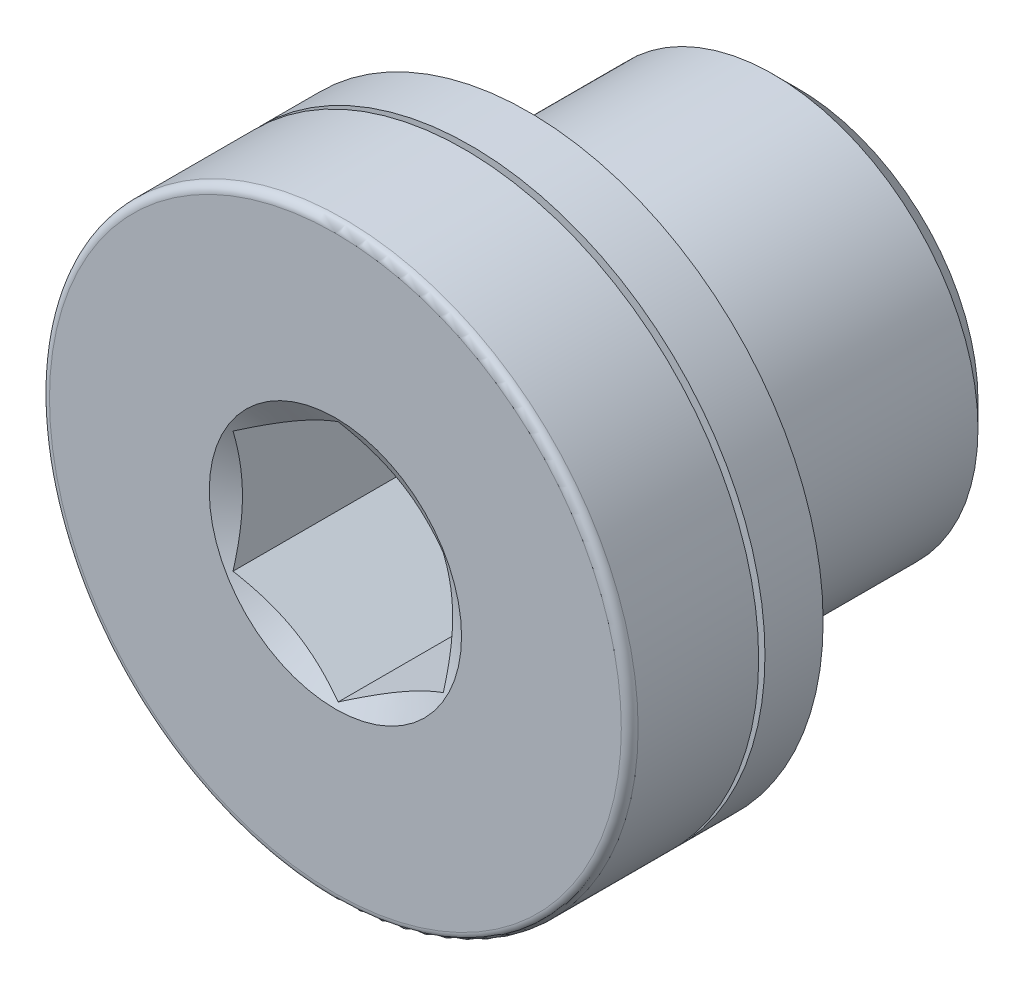
ISO-10303-21;
HEADER;
FILE_DESCRIPTION(('STEP AP214'),'2;1');
FILE_NAME('part.step','',(''),(''),'','','');
FILE_SCHEMA(('AUTOMOTIVE_DESIGN { 1 0 10303 214 1 1 1 1 }'));
ENDSEC;
DATA;
#1=APPLICATION_CONTEXT('core data for automotive mechanical design processes');
#2=APPLICATION_PROTOCOL_DEFINITION('international standard','automotive_design',2000,#1);
#3=PRODUCT_CONTEXT('',#1,'mechanical');
#4=PRODUCT('Part','Part','',(#3));
#5=PRODUCT_RELATED_PRODUCT_CATEGORY('part','',(#4));
#6=PRODUCT_DEFINITION_FORMATION('','',#4);
#7=PRODUCT_DEFINITION_CONTEXT('part definition',#1,'design');
#8=PRODUCT_DEFINITION('design','',#6,#7);
#9=PRODUCT_DEFINITION_SHAPE('','',#8);
#10=(LENGTH_UNIT() NAMED_UNIT(*) SI_UNIT(.MILLI.,.METRE.));
#11=(NAMED_UNIT(*) PLANE_ANGLE_UNIT() SI_UNIT($,.RADIAN.));
#12=(NAMED_UNIT(*) SI_UNIT($,.STERADIAN.) SOLID_ANGLE_UNIT());
#13=UNCERTAINTY_MEASURE_WITH_UNIT(LENGTH_MEASURE(1.E-05),#10,'distance_accuracy_value','');
#14=(GEOMETRIC_REPRESENTATION_CONTEXT(3) GLOBAL_UNCERTAINTY_ASSIGNED_CONTEXT((#13)) GLOBAL_UNIT_ASSIGNED_CONTEXT((#10,
#11,#12)) REPRESENTATION_CONTEXT('',''));
#15=CARTESIAN_POINT('',(0.,0.,0.));
#16=DIRECTION('',(0.,0.,1.));
#17=DIRECTION('',(1.,0.,0.));
#18=AXIS2_PLACEMENT_3D('',#15,#16,#17);
#19=CARTESIAN_POINT('',(0.,0.,4.6));
#20=DIRECTION('',(0.,0.,1.));
#21=DIRECTION('',(1.,0.,0.));
#22=AXIS2_PLACEMENT_3D('',#19,#20,#21);
#23=CONICAL_SURFACE('',#22,3.,1.04719755119659);
#24=CARTESIAN_POINT('',(0.0002,-2.88686681600194,4.53468252976428));
#25=CARTESIAN_POINT('',(-0.109663234734872,-2.82343724785372,4.4980464855128));
#26=CARTESIAN_POINT('',(-0.220474799896527,-2.75946016087832,4.46472708437023));
#27=CARTESIAN_POINT('',(-0.444016833466053,-2.63039810762176,4.40656715096303));
#28=CARTESIAN_POINT('',(-0.556751274528392,-2.56531084772748,4.38174719455291));
#29=CARTESIAN_POINT('',(-0.780822993875274,-2.43594298024478,4.34311051684623));
#30=CARTESIAN_POINT('',(-0.892125791767382,-2.37168227992022,4.32903666159082));
#31=CARTESIAN_POINT('',(-1.11525522746834,-2.24285844015414,4.31223401775793));
#32=CARTESIAN_POINT('',(-1.22708105401423,-2.17829576909552,4.30949131660881));
#33=CARTESIAN_POINT('',(-1.43604197555153,-2.05765212479586,4.31519062541324));
#34=CARTESIAN_POINT('',(-1.53320831755774,-2.00155311108241,4.32223325978705));
#35=CARTESIAN_POINT('',(-1.72690794971101,-1.88972057631679,4.34455628453013));
#36=CARTESIAN_POINT('',(-1.82344056965974,-1.83398744220381,4.35984430384546));
#37=CARTESIAN_POINT('',(-2.01753972174048,-1.72192424450052,4.39806395924961));
#38=CARTESIAN_POINT('',(-2.11508168178214,-1.66560836761319,4.42115764153071));
#39=CARTESIAN_POINT('',(-2.30871060807609,-1.55381665489449,4.47357152198311));
#40=CARTESIAN_POINT('',(-2.40480005588618,-1.49833938633505,4.50287940102974));
#41=CARTESIAN_POINT('',(-2.5002,-1.44326020292026,4.5346825297643));
#42=B_SPLINE_CURVE_WITH_KNOTS('',3,(#24,#25,#26,#27,#28,#29,#30,#31,#32,#33,#34,#35,#36,#37,#38,
#39,#40,#41),.UNSPECIFIED.,.F.,.F.,(4,2,2,2,2,2,2,2,4),(0.,0.396285827362224,0.793524330152046,
1.18093086852113,1.56786160134474,1.90479741793731,2.24204551660461,2.58677531536753,
2.93082800105253),.UNSPECIFIED.);
#43=CARTESIAN_POINT('',(0.,-2.8867513459481,4.53461585909777));
#44=VERTEX_POINT('',#43);
#45=CARTESIAN_POINT('',(-2.5,-1.4433756729741,4.5346158590978));
#46=VERTEX_POINT('',#45);
#47=EDGE_CURVE('E167',#44,#46,#42,.T.);
#48=ORIENTED_EDGE('',*,*,#47,.T.);
#49=CARTESIAN_POINT('',(-2.5,-3.75749145788339,5.47363157625222));
#50=CARTESIAN_POINT('',(-2.5,-3.64919841186996,5.42159269845017));
#51=CARTESIAN_POINT('',(-2.5,-3.54064339466357,5.37008890891806));
#52=CARTESIAN_POINT('',(-2.5,-3.3228694949907,5.26845533167727));
#53=CARTESIAN_POINT('',(-2.5,-3.21365049870229,5.21832578815435));
#54=CARTESIAN_POINT('',(-2.5,-2.99378661171534,5.11946624529765));
#55=CARTESIAN_POINT('',(-2.5,-2.88313709481265,5.07074649627705));
#56=CARTESIAN_POINT('',(-2.5,-2.66091438011002,4.97546923020821));
#57=CARTESIAN_POINT('',(-2.5,-2.54934123033597,4.9289116015586));
#58=CARTESIAN_POINT('',(-2.5,-2.32208129336724,4.83731979627917));
#59=CARTESIAN_POINT('',(-2.5,-2.20636439775533,4.79235988936502));
#60=CARTESIAN_POINT('',(-2.5,-1.97353370620353,4.70614167940336));
#61=CARTESIAN_POINT('',(-2.5,-1.85641974950128,4.66488380710281));
#62=CARTESIAN_POINT('',(-2.5,-1.62086916254349,4.5872406855576));
#63=CARTESIAN_POINT('',(-2.5,-1.50243619221283,4.55084445195485));
#64=CARTESIAN_POINT('',(-2.5,-1.26387801933199,4.48416968869073));
#65=CARTESIAN_POINT('',(-2.5,-1.14375340016755,4.45388910268924));
#66=CARTESIAN_POINT('',(-2.5,-0.902338315588339,4.40111657414383));
#67=CARTESIAN_POINT('',(-2.5,-0.781055515817549,4.37859024001396));
#68=CARTESIAN_POINT('',(-2.5,-0.537116621073338,4.3426935344368));
#69=CARTESIAN_POINT('',(-2.5,-0.414460624499676,4.32932251115766));
#70=CARTESIAN_POINT('',(-2.5,-0.169933632509077,4.31297766586888));
#71=CARTESIAN_POINT('',(-2.5,-0.0480711310514733,4.30987983675657));
#72=CARTESIAN_POINT('',(-2.5,0.195485912370085,4.31402426820572));
#73=CARTESIAN_POINT('',(-2.5,0.317180443894922,4.32126714481277));
#74=CARTESIAN_POINT('',(-2.5,0.527456408460873,4.34222611926243));
#75=CARTESIAN_POINT('',(-2.5,0.616270494320809,4.35371939209446));
#76=CARTESIAN_POINT('',(-2.5,0.793165661114637,4.38142947009885));
#77=CARTESIAN_POINT('',(-2.5,0.881246624045095,4.39764702112567));
#78=CARTESIAN_POINT('',(-2.5,1.14430390620604,4.45252703656414));
#79=CARTESIAN_POINT('',(-2.5,1.31798441198842,4.49740451996552));
#80=CARTESIAN_POINT('',(-2.5,1.66560393932168,4.60012958744614));
#81=CARTESIAN_POINT('',(-2.5,1.83945995346305,4.65824757701734));
#82=CARTESIAN_POINT('',(-2.5,2.09786165668661,4.75179017857617));
#83=CARTESIAN_POINT('',(-2.5,2.1835867516938,4.78402705771562));
#84=CARTESIAN_POINT('',(-2.5,2.35434488597652,4.85028226615287));
#85=CARTESIAN_POINT('',(-2.5,2.43937793702382,4.88430056507499));
#86=CARTESIAN_POINT('',(-2.5,2.65783078845747,4.97390856047049));
#87=CARTESIAN_POINT('',(-2.5,2.79079865565841,5.03059753836762));
#88=CARTESIAN_POINT('',(-2.5,3.05552029816646,5.14675125941288));
#89=CARTESIAN_POINT('',(-2.5,3.1872739810192,5.20621621188097));
#90=CARTESIAN_POINT('',(-2.5,3.44982928957636,5.32729059884971));
#91=CARTESIAN_POINT('',(-2.5,3.58063066968332,5.38890056440082));
#92=CARTESIAN_POINT('',(-2.5,3.84143730899347,5.5137857678841));
#93=CARTESIAN_POINT('',(-2.5,3.97144255002224,5.5770610436589));
#94=CARTESIAN_POINT('',(-2.5,4.36080606086041,5.76899660590649));
#95=CARTESIAN_POINT('',(-2.5,4.61919627366509,5.89961875475503));
#96=CARTESIAN_POINT('',(-2.5,5.13419069594109,6.16422182703926));
#97=CARTESIAN_POINT('',(-2.5,5.39079516582663,6.29820224704552));
#98=CARTESIAN_POINT('',(-2.5,5.87829290022415,6.55556666858143));
#99=CARTESIAN_POINT('',(-2.5,6.1092982352758,6.67873872928103));
#100=CARTESIAN_POINT('',(-2.5,6.57056638334677,6.92648759696893));
#101=CARTESIAN_POINT('',(-2.5,6.80082916311344,7.05106446577326));
#102=CARTESIAN_POINT('',(-2.5,7.26018235402638,7.30094373247041));
#103=CARTESIAN_POINT('',(-2.5,7.48927425655952,7.42624339179654));
#104=CARTESIAN_POINT('',(-2.5,7.94699348534722,7.67765659040072));
#105=CARTESIAN_POINT('',(-2.5,8.17562083840484,7.80377008086275));
#106=CARTESIAN_POINT('',(-2.5,8.40408211674829,7.9301817771395));
#107=B_SPLINE_CURVE_WITH_KNOTS('',3,(#49,#50,#51,#52,#53,#54,#55,#56,#57,#58,#59,#60,#61,#62,
#63,#64,#65,#66,#67,#68,#69,#70,#71,#72,#73,#74,#75,#76,#77,#78,#79,#80,#81,#82,#83,#84,#85,#86,
#87,#88,#89,#90,#91,#92,#93,#94,#95,#96,#97,#98,#99,#100,#101,#102,#103,#104,#105,#106),
.UNSPECIFIED.,.F.,.F.,(4,2,2,2,2,2,2,2,2,2,2,2,2,2,2,2,2,2,2,2,2,2,2,2,2,2,2,2,4),(0.,
0.360447630530675,0.720958898184671,1.08364194495586,1.44630625039165,1.81869010813538,
2.19111723824031,2.56268813752938,2.9341338901541,3.30391031762943,3.6736604153465,
4.03893071469015,4.40422277585142,4.67275529434614,4.94133023092329,5.47881127867105,
6.02844936287521,6.30319201919184,6.57792999229022,7.01152864941954,7.44516005465796,
7.87889959021416,8.31264899062128,9.18119380548513,10.0496091887469,10.8349772920855,
11.6203800900341,12.4037350961383,13.1870435431149),.UNSPECIFIED.);
#108=CARTESIAN_POINT('',(-2.5,1.4433756729741,4.5346158590978));
#109=VERTEX_POINT('',#108);
#110=EDGE_CURVE('E11',#46,#109,#107,.T.);
#111=ORIENTED_EDGE('',*,*,#110,.T.);
#112=CARTESIAN_POINT('',(-2.5002,1.44326020292026,4.5346825297643));
#113=CARTESIAN_POINT('',(-2.39033676526513,1.50668977106848,4.49804648551282));
#114=CARTESIAN_POINT('',(-2.27952520010347,1.57066685804388,4.46472708437025));
#115=CARTESIAN_POINT('',(-2.05598316653394,1.69972891130044,4.40656715096305));
#116=CARTESIAN_POINT('',(-1.9432487254716,1.76481617119472,4.38174719455293));
#117=CARTESIAN_POINT('',(-1.71917700612472,1.89418403867742,4.34311051684624));
#118=CARTESIAN_POINT('',(-1.60787420823261,1.95844473900199,4.32903666159083));
#119=CARTESIAN_POINT('',(-1.38474477253165,2.08726857876806,4.31223401775793));
#120=CARTESIAN_POINT('',(-1.27291894598575,2.15183124982668,4.30949131660881));
#121=CARTESIAN_POINT('',(-1.06395802444846,2.27247489412635,4.31519062541324));
#122=CARTESIAN_POINT('',(-0.966791682442249,2.3285739078398,4.32223325978704));
#123=CARTESIAN_POINT('',(-0.773092050288982,2.44040644260542,4.34455628453012));
#124=CARTESIAN_POINT('',(-0.676559430340254,2.49613957671839,4.35984430384545));
#125=CARTESIAN_POINT('',(-0.482460278259514,2.60820277442168,4.3980639592496));
#126=CARTESIAN_POINT('',(-0.384918318217852,2.66451865130901,4.42115764153069));
#127=CARTESIAN_POINT('',(-0.191289391923912,2.77631036402771,4.47357152198309));
#128=CARTESIAN_POINT('',(-0.0951999441138225,2.83178763258715,4.50287940102972));
#129=CARTESIAN_POINT('',(0.000199999999999802,2.88686681600194,4.53468252976428));
#130=B_SPLINE_CURVE_WITH_KNOTS('',3,(#112,#113,#114,#115,#116,#117,#118,#119,#120,#121,#122,
#123,#124,#125,#126,#127,#128,#129),.UNSPECIFIED.,.F.,.F.,(4,2,2,2,2,2,2,2,4),(0.,
0.39628582736223,0.793524330152058,1.18093086852115,1.56786160134477,1.90479741793733,
2.24204551660462,2.58677531536754,2.93082800105253),.UNSPECIFIED.);
#131=CARTESIAN_POINT('',(0.,2.8867513459481,4.53461585909777));
#132=VERTEX_POINT('',#131);
#133=EDGE_CURVE('E47',#109,#132,#130,.T.);
#134=ORIENTED_EDGE('',*,*,#133,.T.);
#135=CARTESIAN_POINT('',(-0.0002,2.88686681600194,4.53468252976428));
#136=CARTESIAN_POINT('',(0.109663234734872,2.82343724785372,4.4980464855128));
#137=CARTESIAN_POINT('',(0.220474799896527,2.75946016087832,4.46472708437023));
#138=CARTESIAN_POINT('',(0.444016833466053,2.63039810762176,4.40656715096303));
#139=CARTESIAN_POINT('',(0.556751274528392,2.56531084772748,4.38174719455291));
#140=CARTESIAN_POINT('',(0.780822993875274,2.43594298024478,4.34311051684623));
#141=CARTESIAN_POINT('',(0.892125791767382,2.37168227992022,4.32903666159082));
#142=CARTESIAN_POINT('',(1.11525522746834,2.24285844015414,4.31223401775793));
#143=CARTESIAN_POINT('',(1.22708105401423,2.17829576909552,4.30949131660881));
#144=CARTESIAN_POINT('',(1.43604197555153,2.05765212479586,4.31519062541324));
#145=CARTESIAN_POINT('',(1.53320831755774,2.00155311108241,4.32223325978705));
#146=CARTESIAN_POINT('',(1.72690794971101,1.88972057631679,4.34455628453013));
#147=CARTESIAN_POINT('',(1.82344056965974,1.83398744220381,4.35984430384546));
#148=CARTESIAN_POINT('',(2.01753972174048,1.72192424450052,4.39806395924961));
#149=CARTESIAN_POINT('',(2.11508168178214,1.66560836761319,4.42115764153071));
#150=CARTESIAN_POINT('',(2.30871060807609,1.55381665489449,4.47357152198311));
#151=CARTESIAN_POINT('',(2.40480005588618,1.49833938633505,4.50287940102974));
#152=CARTESIAN_POINT('',(2.5002,1.44326020292026,4.5346825297643));
#153=B_SPLINE_CURVE_WITH_KNOTS('',3,(#135,#136,#137,#138,#139,#140,#141,#142,#143,#144,#145,
#146,#147,#148,#149,#150,#151,#152),.UNSPECIFIED.,.F.,.F.,(4,2,2,2,2,2,2,2,4),(0.,
0.396285827362224,0.793524330152046,1.18093086852113,1.56786160134474,1.90479741793731,
2.24204551660461,2.58677531536753,2.93082800105253),.UNSPECIFIED.);
#154=CARTESIAN_POINT('',(2.5,1.4433756729741,4.5346158590978));
#155=VERTEX_POINT('',#154);
#156=EDGE_CURVE('E277',#132,#155,#153,.T.);
#157=ORIENTED_EDGE('',*,*,#156,.T.);
#158=CARTESIAN_POINT('',(2.5,-3.75749145788339,5.47363157625222));
#159=CARTESIAN_POINT('',(2.5,-3.64919841186996,5.42159269845017));
#160=CARTESIAN_POINT('',(2.5,-3.54064339466357,5.37008890891806));
#161=CARTESIAN_POINT('',(2.5,-3.3228694949907,5.26845533167727));
#162=CARTESIAN_POINT('',(2.5,-3.21365049870229,5.21832578815435));
#163=CARTESIAN_POINT('',(2.5,-2.99378661171534,5.11946624529765));
#164=CARTESIAN_POINT('',(2.5,-2.88313709481265,5.07074649627705));
#165=CARTESIAN_POINT('',(2.5,-2.66091438011002,4.97546923020821));
#166=CARTESIAN_POINT('',(2.5,-2.54934123033597,4.9289116015586));
#167=CARTESIAN_POINT('',(2.5,-2.32208129336724,4.83731979627917));
#168=CARTESIAN_POINT('',(2.5,-2.20636439775533,4.79235988936502));
#169=CARTESIAN_POINT('',(2.5,-1.97353370620353,4.70614167940336));
#170=CARTESIAN_POINT('',(2.5,-1.85641974950128,4.66488380710281));
#171=CARTESIAN_POINT('',(2.5,-1.62086916254349,4.5872406855576));
#172=CARTESIAN_POINT('',(2.5,-1.50243619221283,4.55084445195485));
#173=CARTESIAN_POINT('',(2.5,-1.26387801933199,4.48416968869073));
#174=CARTESIAN_POINT('',(2.5,-1.14375340016755,4.45388910268924));
#175=CARTESIAN_POINT('',(2.5,-0.902338315588339,4.40111657414383));
#176=CARTESIAN_POINT('',(2.5,-0.781055515817549,4.37859024001396));
#177=CARTESIAN_POINT('',(2.5,-0.537116621073338,4.3426935344368));
#178=CARTESIAN_POINT('',(2.5,-0.414460624499676,4.32932251115766));
#179=CARTESIAN_POINT('',(2.5,-0.169933632509077,4.31297766586888));
#180=CARTESIAN_POINT('',(2.5,-0.0480711310514733,4.30987983675657));
#181=CARTESIAN_POINT('',(2.5,0.195485912370085,4.31402426820572));
#182=CARTESIAN_POINT('',(2.5,0.317180443894922,4.32126714481277));
#183=CARTESIAN_POINT('',(2.5,0.527456408460873,4.34222611926243));
#184=CARTESIAN_POINT('',(2.5,0.616270494320809,4.35371939209446));
#185=CARTESIAN_POINT('',(2.5,0.793165661114637,4.38142947009885));
#186=CARTESIAN_POINT('',(2.5,0.881246624045095,4.39764702112567));
#187=CARTESIAN_POINT('',(2.5,1.14430390620604,4.45252703656414));
#188=CARTESIAN_POINT('',(2.5,1.31798441198842,4.49740451996552));
#189=CARTESIAN_POINT('',(2.5,1.66560393932168,4.60012958744614));
#190=CARTESIAN_POINT('',(2.5,1.83945995346305,4.65824757701734));
#191=CARTESIAN_POINT('',(2.5,2.09786165668661,4.75179017857617));
#192=CARTESIAN_POINT('',(2.5,2.1835867516938,4.78402705771562));
#193=CARTESIAN_POINT('',(2.5,2.35434488597652,4.85028226615287));
#194=CARTESIAN_POINT('',(2.5,2.43937793702382,4.88430056507499));
#195=CARTESIAN_POINT('',(2.5,2.65783078845747,4.97390856047049));
#196=CARTESIAN_POINT('',(2.5,2.79079865565841,5.03059753836762));
#197=CARTESIAN_POINT('',(2.5,3.05552029816646,5.14675125941288));
#198=CARTESIAN_POINT('',(2.5,3.1872739810192,5.20621621188097));
#199=CARTESIAN_POINT('',(2.5,3.44982928957636,5.32729059884971));
#200=CARTESIAN_POINT('',(2.5,3.58063066968332,5.38890056440082));
#201=CARTESIAN_POINT('',(2.5,3.84143730899347,5.5137857678841));
#202=CARTESIAN_POINT('',(2.5,3.97144255002224,5.5770610436589));
#203=CARTESIAN_POINT('',(2.5,4.36080606086041,5.76899660590649));
#204=CARTESIAN_POINT('',(2.5,4.61919627366509,5.89961875475503));
#205=CARTESIAN_POINT('',(2.5,5.13419069594109,6.16422182703926));
#206=CARTESIAN_POINT('',(2.5,5.39079516582663,6.29820224704552));
#207=CARTESIAN_POINT('',(2.5,5.87829290022415,6.55556666858143));
#208=CARTESIAN_POINT('',(2.5,6.1092982352758,6.67873872928103));
#209=CARTESIAN_POINT('',(2.5,6.57056638334677,6.92648759696893));
#210=CARTESIAN_POINT('',(2.5,6.80082916311344,7.05106446577326));
#211=CARTESIAN_POINT('',(2.5,7.26018235402638,7.30094373247041));
#212=CARTESIAN_POINT('',(2.5,7.48927425655952,7.42624339179654));
#213=CARTESIAN_POINT('',(2.5,7.94699348534722,7.67765659040072));
#214=CARTESIAN_POINT('',(2.5,8.17562083840484,7.80377008086275));
#215=CARTESIAN_POINT('',(2.5,8.40408211674829,7.9301817771395));
#216=B_SPLINE_CURVE_WITH_KNOTS('',3,(#158,#159,#160,#161,#162,#163,#164,#165,#166,#167,#168,
#169,#170,#171,#172,#173,#174,#175,#176,#177,#178,#179,#180,#181,#182,#183,#184,#185,#186,#187,
#188,#189,#190,#191,#192,#193,#194,#195,#196,#197,#198,#199,#200,#201,#202,#203,#204,#205,#206,
#207,#208,#209,#210,#211,#212,#213,#214,#215),.UNSPECIFIED.,.F.,.F.,(4,2,2,2,2,2,2,2,2,2,2,2,2,
2,2,2,2,2,2,2,2,2,2,2,2,2,2,2,4),(0.,0.360447630530675,0.720958898184671,1.08364194495586,
1.44630625039165,1.81869010813538,2.19111723824031,2.56268813752938,2.9341338901541,
3.30391031762943,3.6736604153465,4.03893071469015,4.40422277585142,4.67275529434614,
4.94133023092329,5.47881127867105,6.02844936287521,6.30319201919184,6.57792999229022,
7.01152864941954,7.44516005465796,7.87889959021416,8.31264899062128,9.18119380548513,
10.0496091887469,10.8349772920855,11.6203800900341,12.4037350961383,13.1870435431149),.UNSPECIFIED.);
#217=CARTESIAN_POINT('',(2.5,-1.4433756729741,4.5346158590978));
#218=VERTEX_POINT('',#217);
#219=EDGE_CURVE('E273',#155,#218,#216,.F.);
#220=ORIENTED_EDGE('',*,*,#219,.T.);
#221=CARTESIAN_POINT('',(2.5002,-1.44326020292026,4.5346825297643));
#222=CARTESIAN_POINT('',(2.39033676526513,-1.50668977106848,4.49804648551282));
#223=CARTESIAN_POINT('',(2.27952520010347,-1.57066685804388,4.46472708437025));
#224=CARTESIAN_POINT('',(2.05598316653394,-1.69972891130044,4.40656715096305));
#225=CARTESIAN_POINT('',(1.9432487254716,-1.76481617119472,4.38174719455293));
#226=CARTESIAN_POINT('',(1.71917700612472,-1.89418403867742,4.34311051684624));
#227=CARTESIAN_POINT('',(1.60787420823261,-1.95844473900199,4.32903666159083));
#228=CARTESIAN_POINT('',(1.38474477253165,-2.08726857876806,4.31223401775793));
#229=CARTESIAN_POINT('',(1.27291894598575,-2.15183124982668,4.30949131660881));
#230=CARTESIAN_POINT('',(1.06395802444846,-2.27247489412635,4.31519062541324));
#231=CARTESIAN_POINT('',(0.966791682442249,-2.3285739078398,4.32223325978704));
#232=CARTESIAN_POINT('',(0.773092050288982,-2.44040644260542,4.34455628453012));
#233=CARTESIAN_POINT('',(0.676559430340254,-2.49613957671839,4.35984430384545));
#234=CARTESIAN_POINT('',(0.482460278259514,-2.60820277442168,4.3980639592496));
#235=CARTESIAN_POINT('',(0.384918318217852,-2.66451865130901,4.42115764153069));
#236=CARTESIAN_POINT('',(0.191289391923912,-2.77631036402771,4.47357152198309));
#237=CARTESIAN_POINT('',(0.0951999441138225,-2.83178763258715,4.50287940102972));
#238=CARTESIAN_POINT('',(-0.000199999999999802,-2.88686681600194,4.53468252976428));
#239=B_SPLINE_CURVE_WITH_KNOTS('',3,(#221,#222,#223,#224,#225,#226,#227,#228,#229,#230,#231,
#232,#233,#234,#235,#236,#237,#238),.UNSPECIFIED.,.F.,.F.,(4,2,2,2,2,2,2,2,4),(0.,
0.39628582736223,0.793524330152058,1.18093086852115,1.56786160134477,1.90479741793733,
2.24204551660462,2.58677531536754,2.93082800105253),.UNSPECIFIED.);
#240=EDGE_CURVE('E174',#218,#44,#239,.T.);
#241=ORIENTED_EDGE('',*,*,#240,.T.);
#242=EDGE_LOOP('',(#48,#111,#134,#157,#220,#241));
#243=FACE_BOUND('',#242,.T.);
#244=CARTESIAN_POINT('',(0.,0.,4.6));
#245=DIRECTION('',(0.,0.,1.));
#246=DIRECTION('',(1.,0.,0.));
#247=AXIS2_PLACEMENT_3D('',#244,#245,#246);
#248=CIRCLE('',#247,3.);
#249=CARTESIAN_POINT('',(3.,0.,4.6));
#250=VERTEX_POINT('',#249);
#251=EDGE_CURVE('E164',#250,#250,#248,.T.);
#252=ORIENTED_EDGE('',*,*,#251,.T.);
#253=EDGE_LOOP('',(#252));
#254=FACE_BOUND('',#253,.T.);
#255=ADVANCED_FACE('F34',(#243,#254),#23,.F.);
#256=CARTESIAN_POINT('',(0.,3.,4.6));
#257=DIRECTION('',(0.,0.,-1.));
#258=DIRECTION('',(-1.,0.,0.));
#259=AXIS2_PLACEMENT_3D('',#256,#257,#258);
#260=PLANE('',#259);
#261=ORIENTED_EDGE('',*,*,#251,.F.);
#262=EDGE_LOOP('',(#261));
#263=FACE_BOUND('',#262,.T.);
#264=CARTESIAN_POINT('',(0.,0.,4.6));
#265=DIRECTION('',(0.,0.,1.));
#266=DIRECTION('',(1.,0.,0.));
#267=AXIS2_PLACEMENT_3D('',#264,#265,#266);
#268=CIRCLE('',#267,6.8);
#269=CARTESIAN_POINT('',(6.8,0.,4.6));
#270=VERTEX_POINT('',#269);
#271=EDGE_CURVE('E161',#270,#270,#268,.T.);
#272=ORIENTED_EDGE('',*,*,#271,.T.);
#273=EDGE_LOOP('',(#272));
#274=FACE_BOUND('',#273,.T.);
#275=ADVANCED_FACE('F232',(#263,#274),#260,.F.);
#276=CARTESIAN_POINT('',(0.,0.,4.39999999999997));
#277=DIRECTION('',(0.,0.,1.));
#278=DIRECTION('',(1.,0.,0.));
#279=AXIS2_PLACEMENT_3D('',#276,#277,#278);
#280=TOROIDAL_SURFACE('',#279,6.79999999999997,0.200000000000031);
#281=ORIENTED_EDGE('',*,*,#271,.F.);
#282=EDGE_LOOP('',(#281));
#283=FACE_BOUND('',#282,.T.);
#284=CARTESIAN_POINT('',(0.,0.,4.4));
#285=DIRECTION('',(0.,0.,1.));
#286=DIRECTION('',(1.,0.,0.));
#287=AXIS2_PLACEMENT_3D('',#284,#285,#286);
#288=CIRCLE('',#287,7.);
#289=CARTESIAN_POINT('',(7.,0.,4.4));
#290=VERTEX_POINT('',#289);
#291=EDGE_CURVE('E158',#290,#290,#288,.T.);
#292=ORIENTED_EDGE('',*,*,#291,.T.);
#293=EDGE_LOOP('',(#292));
#294=FACE_BOUND('',#293,.T.);
#295=ADVANCED_FACE('F229',(#283,#294),#280,.T.);
#296=CARTESIAN_POINT('',(0.,0.,-6.4));
#297=DIRECTION('',(0.,0.,1.));
#298=DIRECTION('',(1.,0.,0.));
#299=AXIS2_PLACEMENT_3D('',#296,#297,#298);
#300=CYLINDRICAL_SURFACE('',#299,7.);
#301=ORIENTED_EDGE('',*,*,#291,.F.);
#302=EDGE_LOOP('',(#301));
#303=FACE_BOUND('',#302,.T.);
#304=CARTESIAN_POINT('',(0.,0.,1.5333333333333));
#305=DIRECTION('',(0.,0.,1.));
#306=DIRECTION('',(1.,0.,0.));
#307=AXIS2_PLACEMENT_3D('',#304,#305,#306);
#308=CIRCLE('',#307,7.);
#309=CARTESIAN_POINT('',(7.,0.,1.5333333333333));
#310=VERTEX_POINT('',#309);
#311=EDGE_CURVE('E155',#310,#310,#308,.T.);
#312=ORIENTED_EDGE('',*,*,#311,.T.);
#313=EDGE_LOOP('',(#312));
#314=FACE_BOUND('',#313,.T.);
#315=ADVANCED_FACE('F225',(#303,#314),#300,.T.);
#316=CARTESIAN_POINT('',(0.,7.,1.5333333333333));
#317=DIRECTION('',(0.,0.,1.));
#318=DIRECTION('',(1.,0.,0.));
#319=AXIS2_PLACEMENT_3D('',#316,#317,#318);
#320=PLANE('',#319);
#321=ORIENTED_EDGE('',*,*,#311,.F.);
#322=EDGE_LOOP('',(#321));
#323=FACE_BOUND('',#322,.T.);
#324=CARTESIAN_POINT('',(0.,0.,1.5333333333333));
#325=DIRECTION('',(0.,0.,1.));
#326=DIRECTION('',(1.,0.,0.));
#327=AXIS2_PLACEMENT_3D('',#324,#325,#326);
#328=CIRCLE('',#327,6.3);
#329=CARTESIAN_POINT('',(6.3,0.,1.5333333333333));
#330=VERTEX_POINT('',#329);
#331=EDGE_CURVE('E152',#330,#330,#328,.T.);
#332=ORIENTED_EDGE('',*,*,#331,.T.);
#333=EDGE_LOOP('',(#332));
#334=FACE_BOUND('',#333,.T.);
#335=ADVANCED_FACE('F221',(#323,#334),#320,.F.);
#336=CARTESIAN_POINT('',(0.,0.,-6.4));
#337=DIRECTION('',(0.,0.,1.));
#338=DIRECTION('',(1.,0.,0.));
#339=AXIS2_PLACEMENT_3D('',#336,#337,#338);
#340=CYLINDRICAL_SURFACE('',#339,6.3);
#341=ORIENTED_EDGE('',*,*,#331,.F.);
#342=EDGE_LOOP('',(#341));
#343=FACE_BOUND('',#342,.T.);
#344=CARTESIAN_POINT('',(0.,0.,1.3833333333333));
#345=DIRECTION('',(0.,0.,1.));
#346=DIRECTION('',(1.,0.,0.));
#347=AXIS2_PLACEMENT_3D('',#344,#345,#346);
#348=CIRCLE('',#347,6.3);
#349=CARTESIAN_POINT('',(6.3,0.,1.3833333333333));
#350=VERTEX_POINT('',#349);
#351=EDGE_CURVE('E149',#350,#350,#348,.T.);
#352=ORIENTED_EDGE('',*,*,#351,.T.);
#353=EDGE_LOOP('',(#352));
#354=FACE_BOUND('',#353,.T.);
#355=ADVANCED_FACE('F217',(#343,#354),#340,.T.);
#356=CARTESIAN_POINT('',(0.,6.3,1.3833333333333));
#357=DIRECTION('',(0.,0.,-1.));
#358=DIRECTION('',(-1.,0.,0.));
#359=AXIS2_PLACEMENT_3D('',#356,#357,#358);
#360=PLANE('',#359);
#361=ORIENTED_EDGE('',*,*,#351,.F.);
#362=EDGE_LOOP('',(#361));
#363=FACE_BOUND('',#362,.T.);
#364=CARTESIAN_POINT('',(0.,0.,1.3833333333333));
#365=DIRECTION('',(0.,0.,1.));
#366=DIRECTION('',(1.,0.,0.));
#367=AXIS2_PLACEMENT_3D('',#364,#365,#366);
#368=CIRCLE('',#367,7.);
#369=CARTESIAN_POINT('',(7.,0.,1.3833333333333));
#370=VERTEX_POINT('',#369);
#371=EDGE_CURVE('E146',#370,#370,#368,.T.);
#372=ORIENTED_EDGE('',*,*,#371,.T.);
#373=EDGE_LOOP('',(#372));
#374=FACE_BOUND('',#373,.T.);
#375=ADVANCED_FACE('F213',(#363,#374),#360,.F.);
#376=CARTESIAN_POINT('',(0.,0.,-6.4));
#377=DIRECTION('',(0.,0.,1.));
#378=DIRECTION('',(1.,0.,0.));
#379=AXIS2_PLACEMENT_3D('',#376,#377,#378);
#380=CYLINDRICAL_SURFACE('',#379,7.);
#381=ORIENTED_EDGE('',*,*,#371,.F.);
#382=EDGE_LOOP('',(#381));
#383=FACE_BOUND('',#382,.T.);
#384=CARTESIAN_POINT('',(0.,0.,0.));
#385=DIRECTION('',(0.,0.,1.));
#386=DIRECTION('',(1.,0.,0.));
#387=AXIS2_PLACEMENT_3D('',#384,#385,#386);
#388=CIRCLE('',#387,7.);
#389=CARTESIAN_POINT('',(7.,0.,0.));
#390=VERTEX_POINT('',#389);
#391=EDGE_CURVE('E143',#390,#390,#388,.T.);
#392=ORIENTED_EDGE('',*,*,#391,.T.);
#393=EDGE_LOOP('',(#392));
#394=FACE_BOUND('',#393,.T.);
#395=ADVANCED_FACE('F209',(#383,#394),#380,.T.);
#396=CARTESIAN_POINT('',(0.,7.,0.));
#397=DIRECTION('',(0.,0.,1.));
#398=DIRECTION('',(1.,0.,0.));
#399=AXIS2_PLACEMENT_3D('',#396,#397,#398);
#400=PLANE('',#399);
#401=ORIENTED_EDGE('',*,*,#391,.F.);
#402=EDGE_LOOP('',(#401));
#403=FACE_BOUND('',#402,.T.);
#404=CARTESIAN_POINT('',(0.,0.,0.));
#405=DIRECTION('',(0.,0.,1.));
#406=DIRECTION('',(1.,0.,0.));
#407=AXIS2_PLACEMENT_3D('',#404,#405,#406);
#408=CIRCLE('',#407,4.283);
#409=CARTESIAN_POINT('',(4.283,0.,0.));
#410=VERTEX_POINT('',#409);
#411=EDGE_CURVE('E140',#410,#410,#408,.T.);
#412=ORIENTED_EDGE('',*,*,#411,.T.);
#413=EDGE_LOOP('',(#412));
#414=FACE_BOUND('',#413,.T.);
#415=ADVANCED_FACE('F205',(#403,#414),#400,.F.);
#416=CARTESIAN_POINT('',(0.,0.,-0.581));
#417=DIRECTION('',(0.,0.,-1.));
#418=DIRECTION('',(-1.,0.,0.));
#419=AXIS2_PLACEMENT_3D('',#416,#417,#418);
#420=CONICAL_SURFACE('',#419,4.864,0.785398163397448);
#421=ORIENTED_EDGE('',*,*,#411,.F.);
#422=EDGE_LOOP('',(#421));
#423=FACE_BOUND('',#422,.T.);
#424=CARTESIAN_POINT('',(0.,0.,-0.581));
#425=DIRECTION('',(0.,0.,1.));
#426=DIRECTION('',(1.,0.,0.));
#427=AXIS2_PLACEMENT_3D('',#424,#425,#426);
#428=CIRCLE('',#427,4.864);
#429=CARTESIAN_POINT('',(4.864,0.,-0.581));
#430=VERTEX_POINT('',#429);
#431=EDGE_CURVE('E137',#430,#430,#428,.T.);
#432=ORIENTED_EDGE('',*,*,#431,.T.);
#433=EDGE_LOOP('',(#432));
#434=FACE_BOUND('',#433,.T.);
#435=ADVANCED_FACE('F201',(#423,#434),#420,.T.);
#436=CARTESIAN_POINT('',(0.,0.,-6.4));
#437=DIRECTION('',(0.,0.,1.));
#438=DIRECTION('',(1.,0.,0.));
#439=AXIS2_PLACEMENT_3D('',#436,#437,#438);
#440=CYLINDRICAL_SURFACE('',#439,4.864);
#441=ORIENTED_EDGE('',*,*,#431,.F.);
#442=EDGE_LOOP('',(#441));
#443=FACE_BOUND('',#442,.T.);
#444=CARTESIAN_POINT('',(0.,0.,-5.819));
#445=DIRECTION('',(0.,0.,1.));
#446=DIRECTION('',(1.,0.,0.));
#447=AXIS2_PLACEMENT_3D('',#444,#445,#446);
#448=CIRCLE('',#447,4.864);
#449=CARTESIAN_POINT('',(4.864,0.,-5.819));
#450=VERTEX_POINT('',#449);
#451=EDGE_CURVE('E134',#450,#450,#448,.T.);
#452=ORIENTED_EDGE('',*,*,#451,.T.);
#453=EDGE_LOOP('',(#452));
#454=FACE_BOUND('',#453,.T.);
#455=ADVANCED_FACE('F197',(#443,#454),#440,.T.);
#456=CARTESIAN_POINT('',(0.,0.,-6.4));
#457=DIRECTION('',(0.,0.,1.));
#458=DIRECTION('',(1.,0.,0.));
#459=AXIS2_PLACEMENT_3D('',#456,#457,#458);
#460=CONICAL_SURFACE('',#459,4.283,0.785398163397448);
#461=ORIENTED_EDGE('',*,*,#451,.F.);
#462=EDGE_LOOP('',(#461));
#463=FACE_BOUND('',#462,.T.);
#464=CARTESIAN_POINT('',(0.,0.,-6.4));
#465=DIRECTION('',(0.,0.,1.));
#466=DIRECTION('',(1.,0.,0.));
#467=AXIS2_PLACEMENT_3D('',#464,#465,#466);
#468=CIRCLE('',#467,4.283);
#469=CARTESIAN_POINT('',(4.283,0.,-6.4));
#470=VERTEX_POINT('',#469);
#471=EDGE_CURVE('E122',#470,#470,#468,.T.);
#472=ORIENTED_EDGE('',*,*,#471,.T.);
#473=EDGE_LOOP('',(#472));
#474=FACE_BOUND('',#473,.T.);
#475=ADVANCED_FACE('F193',(#463,#474),#460,.T.);
#476=CARTESIAN_POINT('',(0.,4.283,-6.4));
#477=DIRECTION('',(0.,0.,1.));
#478=DIRECTION('',(1.,0.,0.));
#479=AXIS2_PLACEMENT_3D('',#476,#477,#478);
#480=PLANE('',#479);
#481=ORIENTED_EDGE('',*,*,#471,.F.);
#482=EDGE_LOOP('',(#481));
#483=FACE_BOUND('',#482,.T.);
#484=ADVANCED_FACE('F190',(#483),#480,.F.);
#485=CARTESIAN_POINT('',(-2.5,1.4433756729741,0.));
#486=DIRECTION('',(-1.,0.,0.));
#487=DIRECTION('',(0.,0.,1.));
#488=AXIS2_PLACEMENT_3D('',#485,#486,#487);
#489=PLANE('',#488);
#490=DIRECTION('',(0.,0.,1.));
#491=VECTOR('',#490,1.);
#492=CARTESIAN_POINT('',(-2.5,-1.4433756729741,0.));
#493=LINE('',#492,#491);
#494=CARTESIAN_POINT('',(-2.5,-1.4433756729741,0.));
#495=VERTEX_POINT('',#494);
#496=EDGE_CURVE('E54',#495,#46,#493,.T.);
#497=ORIENTED_EDGE('',*,*,#496,.F.);
#498=DIRECTION('',(0.,-1.,0.));
#499=VECTOR('',#498,1.);
#500=CARTESIAN_POINT('',(-2.5,1.4433756729741,0.));
#501=LINE('',#500,#499);
#502=CARTESIAN_POINT('',(-2.5,1.4433756729741,0.));
#503=VERTEX_POINT('',#502);
#504=EDGE_CURVE('E93',#503,#495,#501,.T.);
#505=ORIENTED_EDGE('',*,*,#504,.F.);
#506=DIRECTION('',(0.,0.,1.));
#507=VECTOR('',#506,1.);
#508=CARTESIAN_POINT('',(-2.5,1.4433756729741,0.));
#509=LINE('',#508,#507);
#510=EDGE_CURVE('E120',#503,#109,#509,.T.);
#511=ORIENTED_EDGE('',*,*,#510,.T.);
#512=ORIENTED_EDGE('',*,*,#110,.F.);
#513=EDGE_LOOP('',(#497,#505,#511,#512));
#514=FACE_BOUND('',#513,.T.);
#515=ADVANCED_FACE('F91',(#514),#489,.F.);
#516=CARTESIAN_POINT('',(0.,2.8867513459481,0.));
#517=DIRECTION('',(-0.499999999999983,0.866025403784448,0.));
#518=DIRECTION('',(-0.866025403784448,-0.499999999999983,0.));
#519=AXIS2_PLACEMENT_3D('',#516,#517,#518);
#520=PLANE('',#519);
#521=ORIENTED_EDGE('',*,*,#510,.F.);
#522=DIRECTION('',(-0.866025403784448,-0.499999999999983,0.));
#523=VECTOR('',#522,1.);
#524=CARTESIAN_POINT('',(0.,2.8867513459481,0.));
#525=LINE('',#524,#523);
#526=CARTESIAN_POINT('',(0.,2.8867513459481,0.));
#527=VERTEX_POINT('',#526);
#528=EDGE_CURVE('E97',#527,#503,#525,.T.);
#529=ORIENTED_EDGE('',*,*,#528,.F.);
#530=DIRECTION('',(0.,0.,1.));
#531=VECTOR('',#530,1.);
#532=CARTESIAN_POINT('',(0.,2.8867513459481,0.));
#533=LINE('',#532,#531);
#534=EDGE_CURVE('E123',#527,#132,#533,.T.);
#535=ORIENTED_EDGE('',*,*,#534,.T.);
#536=ORIENTED_EDGE('',*,*,#133,.F.);
#537=EDGE_LOOP('',(#521,#529,#535,#536));
#538=FACE_BOUND('',#537,.T.);
#539=ADVANCED_FACE('F189',(#538),#520,.F.);
#540=CARTESIAN_POINT('',(2.5,1.4433756729741,0.));
#541=DIRECTION('',(0.499999999999983,0.866025403784448,0.));
#542=DIRECTION('',(-0.866025403784448,0.499999999999983,0.));
#543=AXIS2_PLACEMENT_3D('',#540,#541,#542);
#544=PLANE('',#543);
#545=ORIENTED_EDGE('',*,*,#534,.F.);
#546=DIRECTION('',(-0.866025403784448,0.499999999999983,0.));
#547=VECTOR('',#546,1.);
#548=CARTESIAN_POINT('',(2.5,1.4433756729741,0.));
#549=LINE('',#548,#547);
#550=CARTESIAN_POINT('',(2.5,1.4433756729741,0.));
#551=VERTEX_POINT('',#550);
#552=EDGE_CURVE('E117',#551,#527,#549,.T.);
#553=ORIENTED_EDGE('',*,*,#552,.F.);
#554=DIRECTION('',(0.,0.,1.));
#555=VECTOR('',#554,1.);
#556=CARTESIAN_POINT('',(2.5,1.4433756729741,0.));
#557=LINE('',#556,#555);
#558=EDGE_CURVE('E125',#551,#155,#557,.T.);
#559=ORIENTED_EDGE('',*,*,#558,.T.);
#560=ORIENTED_EDGE('',*,*,#156,.F.);
#561=EDGE_LOOP('',(#545,#553,#559,#560));
#562=FACE_BOUND('',#561,.T.);
#563=ADVANCED_FACE('F276',(#562),#544,.F.);
#564=CARTESIAN_POINT('',(2.5,-1.4433756729741,0.));
#565=DIRECTION('',(1.,0.,0.));
#566=DIRECTION('',(0.,0.,-1.));
#567=AXIS2_PLACEMENT_3D('',#564,#565,#566);
#568=PLANE('',#567);
#569=ORIENTED_EDGE('',*,*,#558,.F.);
#570=DIRECTION('',(0.,1.,0.));
#571=VECTOR('',#570,1.);
#572=CARTESIAN_POINT('',(2.5,-1.4433756729741,0.));
#573=LINE('',#572,#571);
#574=CARTESIAN_POINT('',(2.5,-1.4433756729741,0.));
#575=VERTEX_POINT('',#574);
#576=EDGE_CURVE('E114',#575,#551,#573,.T.);
#577=ORIENTED_EDGE('',*,*,#576,.F.);
#578=DIRECTION('',(0.,0.,1.));
#579=VECTOR('',#578,1.);
#580=CARTESIAN_POINT('',(2.5,-1.4433756729741,0.));
#581=LINE('',#580,#579);
#582=EDGE_CURVE('E128',#575,#218,#581,.T.);
#583=ORIENTED_EDGE('',*,*,#582,.T.);
#584=ORIENTED_EDGE('',*,*,#219,.F.);
#585=EDGE_LOOP('',(#569,#577,#583,#584));
#586=FACE_BOUND('',#585,.T.);
#587=ADVANCED_FACE('F272',(#586),#568,.F.);
#588=CARTESIAN_POINT('',(0.,-2.8867513459481,0.));
#589=DIRECTION('',(0.499999999999983,-0.866025403784448,0.));
#590=DIRECTION('',(0.866025403784448,0.499999999999983,0.));
#591=AXIS2_PLACEMENT_3D('',#588,#589,#590);
#592=PLANE('',#591);
#593=ORIENTED_EDGE('',*,*,#582,.F.);
#594=DIRECTION('',(0.866025403784448,0.499999999999983,0.));
#595=VECTOR('',#594,1.);
#596=CARTESIAN_POINT('',(0.,-2.8867513459481,0.));
#597=LINE('',#596,#595);
#598=CARTESIAN_POINT('',(0.,-2.8867513459481,0.));
#599=VERTEX_POINT('',#598);
#600=EDGE_CURVE('E106',#599,#575,#597,.T.);
#601=ORIENTED_EDGE('',*,*,#600,.F.);
#602=DIRECTION('',(0.,0.,1.));
#603=VECTOR('',#602,1.);
#604=CARTESIAN_POINT('',(0.,-2.8867513459481,0.));
#605=LINE('',#604,#603);
#606=EDGE_CURVE('E96',#599,#44,#605,.T.);
#607=ORIENTED_EDGE('',*,*,#606,.T.);
#608=ORIENTED_EDGE('',*,*,#240,.F.);
#609=EDGE_LOOP('',(#593,#601,#607,#608));
#610=FACE_BOUND('',#609,.T.);
#611=ADVANCED_FACE('F183',(#610),#592,.F.);
#612=CARTESIAN_POINT('',(-2.5,-1.4433756729741,0.));
#613=DIRECTION('',(-0.499999999999983,-0.866025403784448,0.));
#614=DIRECTION('',(0.866025403784448,-0.499999999999983,0.));
#615=AXIS2_PLACEMENT_3D('',#612,#613,#614);
#616=PLANE('',#615);
#617=ORIENTED_EDGE('',*,*,#606,.F.);
#618=DIRECTION('',(0.866025403784448,-0.499999999999983,0.));
#619=VECTOR('',#618,1.);
#620=CARTESIAN_POINT('',(-2.5,-1.4433756729741,0.));
#621=LINE('',#620,#619);
#622=EDGE_CURVE('E100',#495,#599,#621,.T.);
#623=ORIENTED_EDGE('',*,*,#622,.F.);
#624=ORIENTED_EDGE('',*,*,#496,.T.);
#625=ORIENTED_EDGE('',*,*,#47,.F.);
#626=EDGE_LOOP('',(#617,#623,#624,#625));
#627=FACE_BOUND('',#626,.T.);
#628=ADVANCED_FACE('F101',(#627),#616,.F.);
#629=CARTESIAN_POINT('',(0.,0.,0.));
#630=DIRECTION('',(0.,0.,1.));
#631=DIRECTION('',(1.,0.,0.));
#632=AXIS2_PLACEMENT_3D('',#629,#630,#631);
#633=PLANE('',#632);
#634=ORIENTED_EDGE('',*,*,#504,.T.);
#635=ORIENTED_EDGE('',*,*,#622,.T.);
#636=ORIENTED_EDGE('',*,*,#600,.T.);
#637=ORIENTED_EDGE('',*,*,#576,.T.);
#638=ORIENTED_EDGE('',*,*,#552,.T.);
#639=ORIENTED_EDGE('',*,*,#528,.T.);
#640=EDGE_LOOP('',(#634,#635,#636,#637,#638,#639));
#641=FACE_BOUND('',#640,.T.);
#642=ADVANCED_FACE('F108',(#641),#633,.T.);
#643=CLOSED_SHELL('',(#255,#275,#295,#315,#335,#355,#375,#395,#415,#435,#455,#475,#484,#515,
#539,#563,#587,#611,#628,#642));
#644=MANIFOLD_SOLID_BREP('B2',#643);
#645=ADVANCED_BREP_SHAPE_REPRESENTATION('',(#18,#644),#14);
#646=SHAPE_DEFINITION_REPRESENTATION(#9,#645);
ENDSEC;
END-ISO-10303-21;
